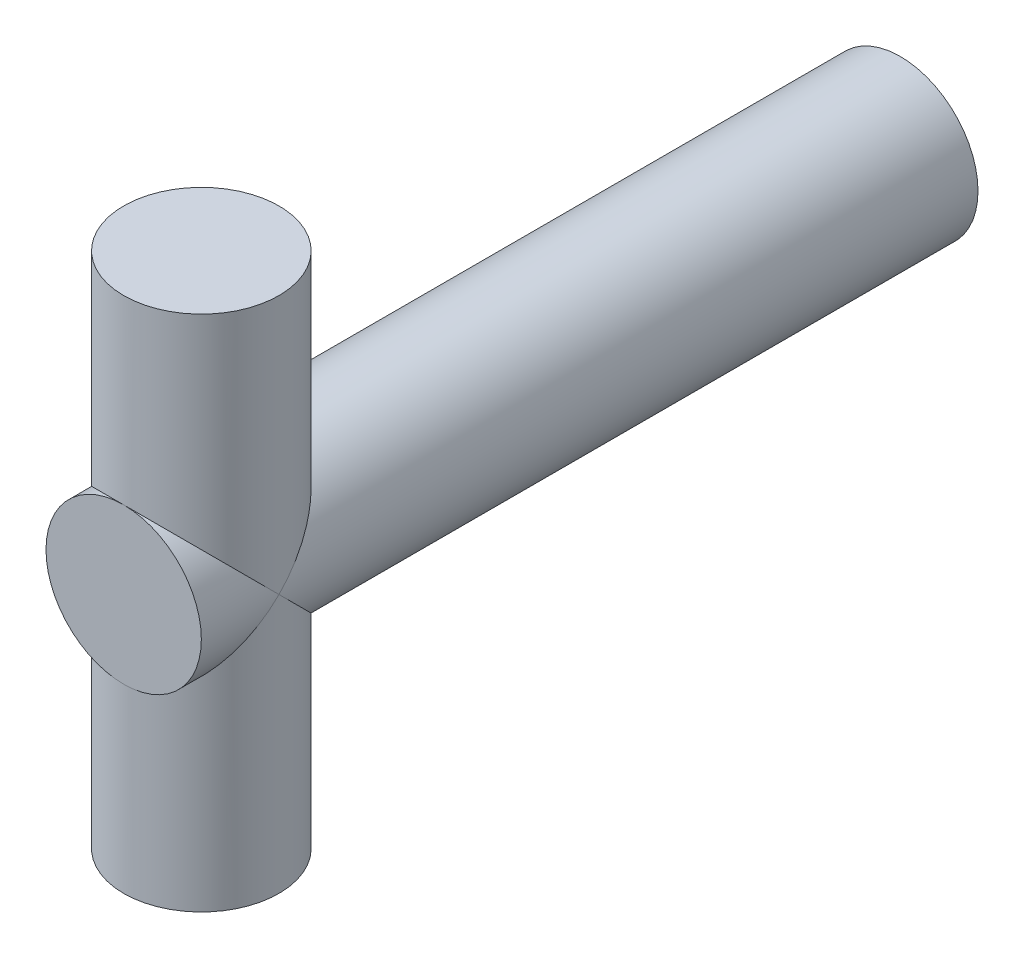
ISO-10303-21;
HEADER;
FILE_DESCRIPTION(('STEP AP214'),'2;1');
FILE_NAME('part.step','',(''),(''),'','','');
FILE_SCHEMA(('AUTOMOTIVE_DESIGN { 1 0 10303 214 1 1 1 1 }'));
ENDSEC;
DATA;
#1=APPLICATION_CONTEXT('core data for automotive mechanical design processes');
#2=APPLICATION_PROTOCOL_DEFINITION('international standard','automotive_design',2000,#1);
#3=PRODUCT_CONTEXT('',#1,'mechanical');
#4=PRODUCT('Part','Part','',(#3));
#5=PRODUCT_RELATED_PRODUCT_CATEGORY('part','',(#4));
#6=PRODUCT_DEFINITION_FORMATION('','',#4);
#7=PRODUCT_DEFINITION_CONTEXT('part definition',#1,'design');
#8=PRODUCT_DEFINITION('design','',#6,#7);
#9=PRODUCT_DEFINITION_SHAPE('','',#8);
#10=(LENGTH_UNIT() NAMED_UNIT(*) SI_UNIT(.MILLI.,.METRE.));
#11=(NAMED_UNIT(*) PLANE_ANGLE_UNIT() SI_UNIT($,.RADIAN.));
#12=(NAMED_UNIT(*) SI_UNIT($,.STERADIAN.) SOLID_ANGLE_UNIT());
#13=UNCERTAINTY_MEASURE_WITH_UNIT(LENGTH_MEASURE(1.E-05),#10,'distance_accuracy_value','');
#14=(GEOMETRIC_REPRESENTATION_CONTEXT(3) GLOBAL_UNCERTAINTY_ASSIGNED_CONTEXT((#13)) GLOBAL_UNIT_ASSIGNED_CONTEXT((#10,
#11,#12)) REPRESENTATION_CONTEXT('',''));
#15=CARTESIAN_POINT('',(0.,0.,0.));
#16=DIRECTION('',(0.,0.,1.));
#17=DIRECTION('',(1.,0.,0.));
#18=AXIS2_PLACEMENT_3D('',#15,#16,#17);
#19=CARTESIAN_POINT('',(0.,0.,15.));
#20=DIRECTION('',(0.,0.,-1.));
#21=DIRECTION('',(-1.,0.,0.));
#22=AXIS2_PLACEMENT_3D('',#19,#20,#21);
#23=CYLINDRICAL_SURFACE('',#22,1.5);
#24=CARTESIAN_POINT('',(0.,0.,13.5));
#25=DIRECTION('',(0.,-0.707106781186547,-0.707106781186547));
#26=DIRECTION('',(0.,0.707106781186547,-0.707106781186547));
#27=AXIS2_PLACEMENT_3D('',#24,#25,#26);
#28=ELLIPSE('',#27,2.12132034355964,1.5);
#29=CARTESIAN_POINT('',(-1.5,0.,13.5));
#30=VERTEX_POINT('',#29);
#31=CARTESIAN_POINT('',(1.5,0.,13.5));
#32=VERTEX_POINT('',#31);
#33=EDGE_CURVE('E58',#30,#32,#28,.T.);
#34=ORIENTED_EDGE('',*,*,#33,.T.);
#35=CARTESIAN_POINT('',(0.,0.,13.5));
#36=DIRECTION('',(0.,0.707106781186547,-0.707106781186547));
#37=DIRECTION('',(0.,-0.707106781186547,-0.707106781186547));
#38=AXIS2_PLACEMENT_3D('',#35,#36,#37);
#39=ELLIPSE('',#38,2.12132034355964,1.5);
#40=EDGE_CURVE('E69',#32,#30,#39,.T.);
#41=ORIENTED_EDGE('',*,*,#40,.T.);
#42=EDGE_LOOP('',(#34,#41));
#43=FACE_BOUND('',#42,.T.);
#44=CARTESIAN_POINT('',(0.,0.,0.));
#45=DIRECTION('',(0.,0.,1.));
#46=DIRECTION('',(1.,0.,0.));
#47=AXIS2_PLACEMENT_3D('',#44,#45,#46);
#48=CIRCLE('',#47,1.5);
#49=CARTESIAN_POINT('',(1.5,0.,0.));
#50=VERTEX_POINT('',#49);
#51=EDGE_CURVE('E38',#50,#50,#48,.T.);
#52=ORIENTED_EDGE('',*,*,#51,.T.);
#53=EDGE_LOOP('',(#52));
#54=FACE_BOUND('',#53,.T.);
#55=ADVANCED_FACE('F35',(#43,#54),#23,.T.);
#56=CARTESIAN_POINT('',(0.,0.,0.));
#57=DIRECTION('',(0.,0.,1.));
#58=DIRECTION('',(1.,0.,0.));
#59=AXIS2_PLACEMENT_3D('',#56,#57,#58);
#60=PLANE('',#59);
#61=ORIENTED_EDGE('',*,*,#51,.F.);
#62=EDGE_LOOP('',(#61));
#63=FACE_BOUND('',#62,.T.);
#64=ADVANCED_FACE('F93',(#63),#60,.F.);
#65=CARTESIAN_POINT('',(0.,-5.,13.5));
#66=DIRECTION('',(0.,1.,0.));
#67=DIRECTION('',(0.,0.,1.));
#68=AXIS2_PLACEMENT_3D('',#65,#66,#67);
#69=PLANE('',#68);
#70=CARTESIAN_POINT('',(0.,-5.,13.5));
#71=DIRECTION('',(0.,1.,0.));
#72=DIRECTION('',(0.,0.,1.));
#73=AXIS2_PLACEMENT_3D('',#70,#71,#72);
#74=CIRCLE('',#73,1.5);
#75=CARTESIAN_POINT('',(0.,-5.,15.));
#76=VERTEX_POINT('',#75);
#77=EDGE_CURVE('E70',#76,#76,#74,.T.);
#78=ORIENTED_EDGE('',*,*,#77,.F.);
#79=EDGE_LOOP('',(#78));
#80=FACE_BOUND('',#79,.T.);
#81=ADVANCED_FACE('F98',(#80),#69,.F.);
#82=CARTESIAN_POINT('',(0.,-5.,13.5));
#83=DIRECTION('',(0.,1.,0.));
#84=DIRECTION('',(0.,0.,1.));
#85=AXIS2_PLACEMENT_3D('',#82,#83,#84);
#86=CYLINDRICAL_SURFACE('',#85,1.5);
#87=ORIENTED_EDGE('',*,*,#77,.T.);
#88=EDGE_LOOP('',(#87));
#89=FACE_BOUND('',#88,.T.);
#90=CARTESIAN_POINT('',(0.,0.,13.5));
#91=DIRECTION('',(0.,-0.707106781186547,-0.707106781186547));
#92=DIRECTION('',(0.,0.707106781186547,-0.707106781186547));
#93=AXIS2_PLACEMENT_3D('',#90,#91,#92);
#94=ELLIPSE('',#93,2.12132034355964,1.5);
#95=CARTESIAN_POINT('',(0.,-1.5,15.));
#96=VERTEX_POINT('',#95);
#97=EDGE_CURVE('E66',#30,#96,#94,.F.);
#98=ORIENTED_EDGE('',*,*,#97,.F.);
#99=ORIENTED_EDGE('',*,*,#40,.F.);
#100=EDGE_CURVE('E50',#96,#32,#94,.F.);
#101=ORIENTED_EDGE('',*,*,#100,.F.);
#102=EDGE_LOOP('',(#98,#99,#101));
#103=FACE_BOUND('',#102,.T.);
#104=ADVANCED_FACE('F65',(#89,#103),#86,.T.);
#105=CARTESIAN_POINT('',(0.,5.,13.5));
#106=DIRECTION('',(0.,1.,0.));
#107=DIRECTION('',(0.,0.,1.));
#108=AXIS2_PLACEMENT_3D('',#105,#106,#107);
#109=CIRCLE('',#108,1.5);
#110=CARTESIAN_POINT('',(0.,5.,15.));
#111=VERTEX_POINT('',#110);
#112=EDGE_CURVE('E161',#111,#111,#109,.T.);
#113=ORIENTED_EDGE('',*,*,#112,.F.);
#114=EDGE_LOOP('',(#113));
#115=FACE_BOUND('',#114,.T.);
#116=CARTESIAN_POINT('',(0.,0.,13.5));
#117=DIRECTION('',(0.,0.707106781186547,-0.707106781186547));
#118=DIRECTION('',(0.,-0.707106781186547,-0.707106781186547));
#119=AXIS2_PLACEMENT_3D('',#116,#117,#118);
#120=ELLIPSE('',#119,2.12132034355964,1.5);
#121=CARTESIAN_POINT('',(0.,1.5,15.));
#122=VERTEX_POINT('',#121);
#123=EDGE_CURVE('E76',#32,#122,#120,.F.);
#124=ORIENTED_EDGE('',*,*,#123,.F.);
#125=ORIENTED_EDGE('',*,*,#33,.F.);
#126=EDGE_CURVE('E75',#122,#30,#120,.F.);
#127=ORIENTED_EDGE('',*,*,#126,.F.);
#128=EDGE_LOOP('',(#124,#125,#127));
#129=FACE_BOUND('',#128,.T.);
#130=ADVANCED_FACE('F88',(#115,#129),#86,.T.);
#131=CARTESIAN_POINT('',(0.,5.,13.5));
#132=DIRECTION('',(0.,1.,0.));
#133=DIRECTION('',(0.,0.,1.));
#134=AXIS2_PLACEMENT_3D('',#131,#132,#133);
#135=PLANE('',#134);
#136=ORIENTED_EDGE('',*,*,#112,.T.);
#137=EDGE_LOOP('',(#136));
#138=FACE_BOUND('',#137,.T.);
#139=ADVANCED_FACE('F82',(#138),#135,.T.);
#140=CARTESIAN_POINT('',(0.,0.,15.));
#141=DIRECTION('',(0.,0.,1.));
#142=DIRECTION('',(1.,0.,0.));
#143=AXIS2_PLACEMENT_3D('',#140,#141,#142);
#144=PLANE('',#143);
#145=CARTESIAN_POINT('',(0.,0.,15.));
#146=DIRECTION('',(0.,0.,1.));
#147=DIRECTION('',(1.,0.,0.));
#148=AXIS2_PLACEMENT_3D('',#145,#146,#147);
#149=CIRCLE('',#148,1.5);
#150=EDGE_CURVE('E43',#96,#122,#149,.T.);
#151=ORIENTED_EDGE('',*,*,#150,.T.);
#152=EDGE_CURVE('E11',#122,#96,#149,.T.);
#153=ORIENTED_EDGE('',*,*,#152,.T.);
#154=EDGE_LOOP('',(#151,#153));
#155=FACE_BOUND('',#154,.T.);
#156=ADVANCED_FACE('F80',(#155),#144,.T.);
#157=ORIENTED_EDGE('',*,*,#100,.T.);
#158=ORIENTED_EDGE('',*,*,#123,.T.);
#159=ORIENTED_EDGE('',*,*,#150,.F.);
#160=EDGE_LOOP('',(#157,#158,#159));
#161=FACE_BOUND('',#160,.T.);
#162=ADVANCED_FACE('F78',(#161),#23,.T.);
#163=ORIENTED_EDGE('',*,*,#152,.F.);
#164=ORIENTED_EDGE('',*,*,#126,.T.);
#165=ORIENTED_EDGE('',*,*,#97,.T.);
#166=EDGE_LOOP('',(#163,#164,#165));
#167=FACE_BOUND('',#166,.T.);
#168=ADVANCED_FACE('F74',(#167),#23,.T.);
#169=CLOSED_SHELL('',(#55,#64,#81,#104,#130,#139,#156,#162,#168));
#170=MANIFOLD_SOLID_BREP('B2',#169);
#171=ADVANCED_BREP_SHAPE_REPRESENTATION('',(#18,#170),#14);
#172=SHAPE_DEFINITION_REPRESENTATION(#9,#171);
ENDSEC;
END-ISO-10303-21;
